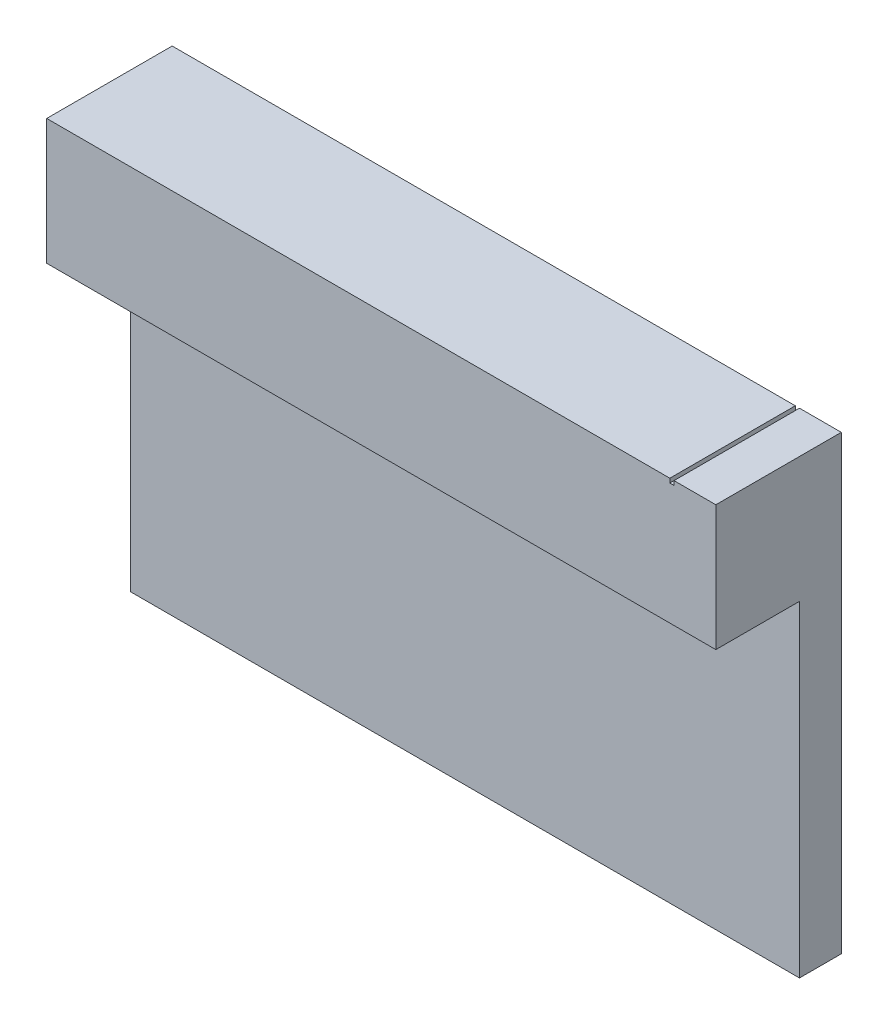
ISO-10303-21;
HEADER;
FILE_DESCRIPTION(('STEP AP214'),'2;1');
FILE_NAME('part.step','',(''),(''),'','','');
FILE_SCHEMA(('AUTOMOTIVE_DESIGN { 1 0 10303 214 1 1 1 1 }'));
ENDSEC;
DATA;
#1=APPLICATION_CONTEXT('core data for automotive mechanical design processes');
#2=APPLICATION_PROTOCOL_DEFINITION('international standard','automotive_design',2000,#1);
#3=PRODUCT_CONTEXT('',#1,'mechanical');
#4=PRODUCT('Part','Part','',(#3));
#5=PRODUCT_RELATED_PRODUCT_CATEGORY('part','',(#4));
#6=PRODUCT_DEFINITION_FORMATION('','',#4);
#7=PRODUCT_DEFINITION_CONTEXT('part definition',#1,'design');
#8=PRODUCT_DEFINITION('design','',#6,#7);
#9=PRODUCT_DEFINITION_SHAPE('','',#8);
#10=(LENGTH_UNIT() NAMED_UNIT(*) SI_UNIT(.MILLI.,.METRE.));
#11=(NAMED_UNIT(*) PLANE_ANGLE_UNIT() SI_UNIT($,.RADIAN.));
#12=(NAMED_UNIT(*) SI_UNIT($,.STERADIAN.) SOLID_ANGLE_UNIT());
#13=UNCERTAINTY_MEASURE_WITH_UNIT(LENGTH_MEASURE(1.E-05),#10,'distance_accuracy_value','');
#14=(GEOMETRIC_REPRESENTATION_CONTEXT(3) GLOBAL_UNCERTAINTY_ASSIGNED_CONTEXT((#13)) GLOBAL_UNIT_ASSIGNED_CONTEXT((#10,
#11,#12)) REPRESENTATION_CONTEXT('',''));
#15=CARTESIAN_POINT('',(0.,0.,0.));
#16=DIRECTION('',(0.,0.,1.));
#17=DIRECTION('',(1.,0.,0.));
#18=AXIS2_PLACEMENT_3D('',#15,#16,#17);
#19=CARTESIAN_POINT('',(-52.8123523343083,21.9483402489627,10.));
#20=DIRECTION('',(0.,-1.,0.));
#21=DIRECTION('',(0.,0.,-1.));
#22=AXIS2_PLACEMENT_3D('',#19,#20,#21);
#23=PLANE('',#22);
#24=DIRECTION('',(-1.,0.,0.));
#25=VECTOR('',#24,1.);
#26=CARTESIAN_POINT('',(-52.8123523343083,21.9483402489627,30.));
#27=LINE('',#26,#25);
#28=CARTESIAN_POINT('',(96.1876476656917,21.9483402489627,30.));
#29=VERTEX_POINT('',#28);
#30=CARTESIAN_POINT('',(-52.8123523343083,21.9483402489627,30.));
#31=VERTEX_POINT('',#30);
#32=EDGE_CURVE('E147',#29,#31,#27,.T.);
#33=ORIENTED_EDGE('',*,*,#32,.F.);
#34=DIRECTION('',(0.,0.,1.));
#35=VECTOR('',#34,1.);
#36=CARTESIAN_POINT('',(96.1876476656917,21.9483402489627,0.));
#37=LINE('',#36,#35);
#38=CARTESIAN_POINT('',(96.1876476656917,21.9483402489627,0.));
#39=VERTEX_POINT('',#38);
#40=EDGE_CURVE('E205',#39,#29,#37,.T.);
#41=ORIENTED_EDGE('',*,*,#40,.F.);
#42=DIRECTION('',(-1.,0.,0.));
#43=VECTOR('',#42,1.);
#44=CARTESIAN_POINT('',(-52.8123523343083,21.9483402489627,0.));
#45=LINE('',#44,#43);
#46=CARTESIAN_POINT('',(-52.8123523343083,21.9483402489627,0.));
#47=VERTEX_POINT('',#46);
#48=EDGE_CURVE('E180',#39,#47,#45,.T.);
#49=ORIENTED_EDGE('',*,*,#48,.T.);
#50=DIRECTION('',(0.,0.,-1.));
#51=VECTOR('',#50,1.);
#52=CARTESIAN_POINT('',(-52.8123523343083,21.9483402489627,10.));
#53=LINE('',#52,#51);
#54=EDGE_CURVE('E185',#31,#47,#53,.T.);
#55=ORIENTED_EDGE('',*,*,#54,.F.);
#56=EDGE_LOOP('',(#33,#41,#49,#55));
#57=FACE_BOUND('',#56,.T.);
#58=ADVANCED_FACE('F33',(#57),#23,.F.);
#59=CARTESIAN_POINT('',(-52.8123523343083,21.9483402489627,10.));
#60=DIRECTION('',(1.,0.,0.));
#61=DIRECTION('',(0.,1.,0.));
#62=AXIS2_PLACEMENT_3D('',#59,#60,#61);
#63=PLANE('',#62);
#64=DIRECTION('',(0.,-1.,0.));
#65=VECTOR('',#64,1.);
#66=CARTESIAN_POINT('',(-52.8123523343083,21.9483402489627,0.));
#67=LINE('',#66,#65);
#68=CARTESIAN_POINT('',(-52.8123523343083,-86.0516597510373,0.));
#69=VERTEX_POINT('',#68);
#70=EDGE_CURVE('E165',#47,#69,#67,.T.);
#71=ORIENTED_EDGE('',*,*,#70,.T.);
#72=DIRECTION('',(0.,0.,-1.));
#73=VECTOR('',#72,1.);
#74=CARTESIAN_POINT('',(-52.8123523343083,-86.0516597510373,10.));
#75=LINE('',#74,#73);
#76=CARTESIAN_POINT('',(-52.8123523343083,-86.0516597510373,10.));
#77=VERTEX_POINT('',#76);
#78=EDGE_CURVE('E11',#77,#69,#75,.T.);
#79=ORIENTED_EDGE('',*,*,#78,.F.);
#80=DIRECTION('',(0.,-1.,0.));
#81=VECTOR('',#80,1.);
#82=CARTESIAN_POINT('',(-52.8123523343083,21.9483402489627,10.));
#83=LINE('',#82,#81);
#84=CARTESIAN_POINT('',(-52.8123523343083,-8.05165975103735,10.));
#85=VERTEX_POINT('',#84);
#86=EDGE_CURVE('E184',#85,#77,#83,.T.);
#87=ORIENTED_EDGE('',*,*,#86,.F.);
#88=DIRECTION('',(0.,0.,-1.));
#89=VECTOR('',#88,1.);
#90=CARTESIAN_POINT('',(-52.8123523343083,-8.05165975103735,30.));
#91=LINE('',#90,#89);
#92=CARTESIAN_POINT('',(-52.8123523343083,-8.05165975103735,30.));
#93=VERTEX_POINT('',#92);
#94=EDGE_CURVE('E162',#93,#85,#91,.T.);
#95=ORIENTED_EDGE('',*,*,#94,.F.);
#96=DIRECTION('',(0.,-1.,0.));
#97=VECTOR('',#96,1.);
#98=CARTESIAN_POINT('',(-52.8123523343083,21.9483402489627,30.));
#99=LINE('',#98,#97);
#100=EDGE_CURVE('E140',#31,#93,#99,.T.);
#101=ORIENTED_EDGE('',*,*,#100,.F.);
#102=ORIENTED_EDGE('',*,*,#54,.T.);
#103=EDGE_LOOP('',(#71,#79,#87,#95,#101,#102));
#104=FACE_BOUND('',#103,.T.);
#105=ADVANCED_FACE('F35',(#104),#63,.F.);
#106=CARTESIAN_POINT('',(-52.8123523343083,-86.0516597510373,10.));
#107=DIRECTION('',(0.,1.,0.));
#108=DIRECTION('',(0.,0.,1.));
#109=AXIS2_PLACEMENT_3D('',#106,#107,#108);
#110=PLANE('',#109);
#111=DIRECTION('',(1.,0.,0.));
#112=VECTOR('',#111,1.);
#113=CARTESIAN_POINT('',(-52.8123523343083,-86.0516597510373,0.));
#114=LINE('',#113,#112);
#115=CARTESIAN_POINT('',(107.187647665692,-86.0516597510373,0.));
#116=VERTEX_POINT('',#115);
#117=EDGE_CURVE('E169',#69,#116,#114,.T.);
#118=ORIENTED_EDGE('',*,*,#117,.T.);
#119=DIRECTION('',(0.,0.,-1.));
#120=VECTOR('',#119,1.);
#121=CARTESIAN_POINT('',(107.187647665692,-86.0516597510373,10.));
#122=LINE('',#121,#120);
#123=CARTESIAN_POINT('',(107.187647665692,-86.0516597510373,10.));
#124=VERTEX_POINT('',#123);
#125=EDGE_CURVE('E42',#124,#116,#122,.T.);
#126=ORIENTED_EDGE('',*,*,#125,.F.);
#127=DIRECTION('',(1.,0.,0.));
#128=VECTOR('',#127,1.);
#129=CARTESIAN_POINT('',(-52.8123523343083,-86.0516597510373,10.));
#130=LINE('',#129,#128);
#131=EDGE_CURVE('E191',#77,#124,#130,.T.);
#132=ORIENTED_EDGE('',*,*,#131,.F.);
#133=ORIENTED_EDGE('',*,*,#78,.T.);
#134=EDGE_LOOP('',(#118,#126,#132,#133));
#135=FACE_BOUND('',#134,.T.);
#136=ADVANCED_FACE('F222',(#135),#110,.F.);
#137=CARTESIAN_POINT('',(107.187647665692,21.9483402489627,10.));
#138=DIRECTION('',(-1.,0.,0.));
#139=DIRECTION('',(0.,0.,1.));
#140=AXIS2_PLACEMENT_3D('',#137,#138,#139);
#141=PLANE('',#140);
#142=DIRECTION('',(0.,1.,0.));
#143=VECTOR('',#142,1.);
#144=CARTESIAN_POINT('',(107.187647665692,21.9483402489627,0.));
#145=LINE('',#144,#143);
#146=CARTESIAN_POINT('',(107.187647665692,21.9483402489627,0.));
#147=VERTEX_POINT('',#146);
#148=EDGE_CURVE('E175',#116,#147,#145,.T.);
#149=ORIENTED_EDGE('',*,*,#148,.T.);
#150=DIRECTION('',(0.,0.,-1.));
#151=VECTOR('',#150,1.);
#152=CARTESIAN_POINT('',(107.187647665692,21.9483402489627,10.));
#153=LINE('',#152,#151);
#154=CARTESIAN_POINT('',(107.187647665692,21.9483402489627,30.));
#155=VERTEX_POINT('',#154);
#156=EDGE_CURVE('E187',#155,#147,#153,.T.);
#157=ORIENTED_EDGE('',*,*,#156,.F.);
#158=DIRECTION('',(0.,1.,0.));
#159=VECTOR('',#158,1.);
#160=CARTESIAN_POINT('',(107.187647665692,21.9483402489627,30.));
#161=LINE('',#160,#159);
#162=CARTESIAN_POINT('',(107.187647665692,-8.05165975103735,30.));
#163=VERTEX_POINT('',#162);
#164=EDGE_CURVE('E145',#163,#155,#161,.T.);
#165=ORIENTED_EDGE('',*,*,#164,.F.);
#166=DIRECTION('',(0.,0.,-1.));
#167=VECTOR('',#166,1.);
#168=CARTESIAN_POINT('',(107.187647665692,-8.05165975103735,30.));
#169=LINE('',#168,#167);
#170=CARTESIAN_POINT('',(107.187647665692,-8.05165975103735,10.));
#171=VERTEX_POINT('',#170);
#172=EDGE_CURVE('E149',#163,#171,#169,.T.);
#173=ORIENTED_EDGE('',*,*,#172,.T.);
#174=DIRECTION('',(0.,1.,0.));
#175=VECTOR('',#174,1.);
#176=CARTESIAN_POINT('',(107.187647665692,21.9483402489627,10.));
#177=LINE('',#176,#175);
#178=EDGE_CURVE('E157',#124,#171,#177,.T.);
#179=ORIENTED_EDGE('',*,*,#178,.F.);
#180=ORIENTED_EDGE('',*,*,#125,.T.);
#181=EDGE_LOOP('',(#149,#157,#165,#173,#179,#180));
#182=FACE_BOUND('',#181,.T.);
#183=ADVANCED_FACE('F200',(#182),#141,.F.);
#184=CARTESIAN_POINT('',(97.1876476656917,21.9483402489627,0.));
#185=VERTEX_POINT('',#184);
#186=EDGE_CURVE('E181',#147,#185,#45,.T.);
#187=ORIENTED_EDGE('',*,*,#186,.T.);
#188=DIRECTION('',(0.,0.,-1.));
#189=VECTOR('',#188,1.);
#190=CARTESIAN_POINT('',(97.1876476656917,21.9483402489627,0.));
#191=LINE('',#190,#189);
#192=CARTESIAN_POINT('',(97.1876476656917,21.9483402489627,30.));
#193=VERTEX_POINT('',#192);
#194=EDGE_CURVE('E204',#193,#185,#191,.T.);
#195=ORIENTED_EDGE('',*,*,#194,.F.);
#196=EDGE_CURVE('E132',#155,#193,#27,.T.);
#197=ORIENTED_EDGE('',*,*,#196,.F.);
#198=ORIENTED_EDGE('',*,*,#156,.T.);
#199=EDGE_LOOP('',(#187,#195,#197,#198));
#200=FACE_BOUND('',#199,.T.);
#201=ADVANCED_FACE('F202',(#200),#23,.F.);
#202=CARTESIAN_POINT('',(0.,0.,10.));
#203=DIRECTION('',(0.,0.,1.));
#204=DIRECTION('',(1.,0.,0.));
#205=AXIS2_PLACEMENT_3D('',#202,#203,#204);
#206=PLANE('',#205);
#207=DIRECTION('',(1.,0.,0.));
#208=VECTOR('',#207,1.);
#209=CARTESIAN_POINT('',(-52.8123523343083,-8.05165975103735,10.));
#210=LINE('',#209,#208);
#211=EDGE_CURVE('E58',#85,#171,#210,.T.);
#212=ORIENTED_EDGE('',*,*,#211,.F.);
#213=ORIENTED_EDGE('',*,*,#86,.T.);
#214=ORIENTED_EDGE('',*,*,#131,.T.);
#215=ORIENTED_EDGE('',*,*,#178,.T.);
#216=EDGE_LOOP('',(#212,#213,#214,#215));
#217=FACE_BOUND('',#216,.T.);
#218=ADVANCED_FACE('F195',(#217),#206,.T.);
#219=CARTESIAN_POINT('',(0.,0.,0.));
#220=DIRECTION('',(0.,0.,1.));
#221=DIRECTION('',(1.,0.,0.));
#222=AXIS2_PLACEMENT_3D('',#219,#220,#221);
#223=PLANE('',#222);
#224=ORIENTED_EDGE('',*,*,#48,.F.);
#225=DIRECTION('',(0.,1.,0.));
#226=VECTOR('',#225,1.);
#227=CARTESIAN_POINT('',(96.1876476656917,20.9483402489627,0.));
#228=LINE('',#227,#226);
#229=CARTESIAN_POINT('',(96.1876476656917,20.9483402489627,0.));
#230=VERTEX_POINT('',#229);
#231=EDGE_CURVE('E135',#230,#39,#228,.T.);
#232=ORIENTED_EDGE('',*,*,#231,.F.);
#233=DIRECTION('',(-1.,0.,0.));
#234=VECTOR('',#233,1.);
#235=CARTESIAN_POINT('',(96.1876476656917,20.9483402489627,0.));
#236=LINE('',#235,#234);
#237=CARTESIAN_POINT('',(97.1876476656917,20.9483402489627,0.));
#238=VERTEX_POINT('',#237);
#239=EDGE_CURVE('E120',#238,#230,#236,.T.);
#240=ORIENTED_EDGE('',*,*,#239,.F.);
#241=DIRECTION('',(0.,1.,0.));
#242=VECTOR('',#241,1.);
#243=CARTESIAN_POINT('',(97.1876476656917,20.9483402489627,0.));
#244=LINE('',#243,#242);
#245=EDGE_CURVE('E118',#238,#185,#244,.T.);
#246=ORIENTED_EDGE('',*,*,#245,.T.);
#247=ORIENTED_EDGE('',*,*,#186,.F.);
#248=ORIENTED_EDGE('',*,*,#148,.F.);
#249=ORIENTED_EDGE('',*,*,#117,.F.);
#250=ORIENTED_EDGE('',*,*,#70,.F.);
#251=EDGE_LOOP('',(#224,#232,#240,#246,#247,#248,#249,#250));
#252=FACE_BOUND('',#251,.T.);
#253=ADVANCED_FACE('F219',(#252),#223,.F.);
#254=CARTESIAN_POINT('',(-52.8123523343083,-8.05165975103735,30.));
#255=DIRECTION('',(0.,1.,0.));
#256=DIRECTION('',(0.,0.,1.));
#257=AXIS2_PLACEMENT_3D('',#254,#255,#256);
#258=PLANE('',#257);
#259=ORIENTED_EDGE('',*,*,#211,.T.);
#260=ORIENTED_EDGE('',*,*,#172,.F.);
#261=DIRECTION('',(1.,0.,0.));
#262=VECTOR('',#261,1.);
#263=CARTESIAN_POINT('',(-52.8123523343083,-8.05165975103735,30.));
#264=LINE('',#263,#262);
#265=EDGE_CURVE('E143',#93,#163,#264,.T.);
#266=ORIENTED_EDGE('',*,*,#265,.F.);
#267=ORIENTED_EDGE('',*,*,#94,.T.);
#268=EDGE_LOOP('',(#259,#260,#266,#267));
#269=FACE_BOUND('',#268,.T.);
#270=ADVANCED_FACE('F198',(#269),#258,.F.);
#271=CARTESIAN_POINT('',(0.,0.,30.));
#272=DIRECTION('',(0.,0.,1.));
#273=DIRECTION('',(1.,0.,0.));
#274=AXIS2_PLACEMENT_3D('',#271,#272,#273);
#275=PLANE('',#274);
#276=DIRECTION('',(0.,1.,0.));
#277=VECTOR('',#276,1.);
#278=CARTESIAN_POINT('',(96.1876476656917,20.9483402489627,30.));
#279=LINE('',#278,#277);
#280=CARTESIAN_POINT('',(96.1876476656917,20.9483402489627,30.));
#281=VERTEX_POINT('',#280);
#282=EDGE_CURVE('E133',#281,#29,#279,.T.);
#283=ORIENTED_EDGE('',*,*,#282,.T.);
#284=ORIENTED_EDGE('',*,*,#32,.T.);
#285=ORIENTED_EDGE('',*,*,#100,.T.);
#286=ORIENTED_EDGE('',*,*,#265,.T.);
#287=ORIENTED_EDGE('',*,*,#164,.T.);
#288=ORIENTED_EDGE('',*,*,#196,.T.);
#289=DIRECTION('',(0.,1.,0.));
#290=VECTOR('',#289,1.);
#291=CARTESIAN_POINT('',(97.1876476656917,20.9483402489627,30.));
#292=LINE('',#291,#290);
#293=CARTESIAN_POINT('',(97.1876476656917,20.9483402489627,30.));
#294=VERTEX_POINT('',#293);
#295=EDGE_CURVE('E115',#294,#193,#292,.T.);
#296=ORIENTED_EDGE('',*,*,#295,.F.);
#297=DIRECTION('',(1.,0.,0.));
#298=VECTOR('',#297,1.);
#299=CARTESIAN_POINT('',(96.1876476656917,20.9483402489627,30.));
#300=LINE('',#299,#298);
#301=EDGE_CURVE('E121',#281,#294,#300,.T.);
#302=ORIENTED_EDGE('',*,*,#301,.F.);
#303=EDGE_LOOP('',(#283,#284,#285,#286,#287,#288,#296,#302));
#304=FACE_BOUND('',#303,.T.);
#305=ADVANCED_FACE('F129',(#304),#275,.T.);
#306=CARTESIAN_POINT('',(96.1876476656917,20.9483402489627,0.));
#307=DIRECTION('',(-1.,0.,0.));
#308=DIRECTION('',(0.,0.,1.));
#309=AXIS2_PLACEMENT_3D('',#306,#307,#308);
#310=PLANE('',#309);
#311=ORIENTED_EDGE('',*,*,#40,.T.);
#312=ORIENTED_EDGE('',*,*,#282,.F.);
#313=DIRECTION('',(0.,0.,1.));
#314=VECTOR('',#313,1.);
#315=CARTESIAN_POINT('',(96.1876476656917,20.9483402489627,0.));
#316=LINE('',#315,#314);
#317=EDGE_CURVE('E50',#230,#281,#316,.T.);
#318=ORIENTED_EDGE('',*,*,#317,.F.);
#319=ORIENTED_EDGE('',*,*,#231,.T.);
#320=EDGE_LOOP('',(#311,#312,#318,#319));
#321=FACE_BOUND('',#320,.T.);
#322=ADVANCED_FACE('F213',(#321),#310,.F.);
#323=CARTESIAN_POINT('',(97.1876476656917,20.9483402489627,0.));
#324=DIRECTION('',(1.,0.,0.));
#325=DIRECTION('',(0.,0.,-1.));
#326=AXIS2_PLACEMENT_3D('',#323,#324,#325);
#327=PLANE('',#326);
#328=ORIENTED_EDGE('',*,*,#194,.T.);
#329=ORIENTED_EDGE('',*,*,#245,.F.);
#330=DIRECTION('',(0.,0.,-1.));
#331=VECTOR('',#330,1.);
#332=CARTESIAN_POINT('',(97.1876476656917,20.9483402489627,0.));
#333=LINE('',#332,#331);
#334=EDGE_CURVE('E112',#294,#238,#333,.T.);
#335=ORIENTED_EDGE('',*,*,#334,.F.);
#336=ORIENTED_EDGE('',*,*,#295,.T.);
#337=EDGE_LOOP('',(#328,#329,#335,#336));
#338=FACE_BOUND('',#337,.T.);
#339=ADVANCED_FACE('F113',(#338),#327,.F.);
#340=CARTESIAN_POINT('',(0.,20.9483402489627,0.));
#341=DIRECTION('',(0.,1.,0.));
#342=DIRECTION('',(0.,0.,1.));
#343=AXIS2_PLACEMENT_3D('',#340,#341,#342);
#344=PLANE('',#343);
#345=ORIENTED_EDGE('',*,*,#317,.T.);
#346=ORIENTED_EDGE('',*,*,#301,.T.);
#347=ORIENTED_EDGE('',*,*,#334,.T.);
#348=ORIENTED_EDGE('',*,*,#239,.T.);
#349=EDGE_LOOP('',(#345,#346,#347,#348));
#350=FACE_BOUND('',#349,.T.);
#351=ADVANCED_FACE('F124',(#350),#344,.T.);
#352=CLOSED_SHELL('',(#58,#105,#136,#183,#201,#218,#253,#270,#305,#322,#339,#351));
#353=MANIFOLD_SOLID_BREP('B2',#352);
#354=ADVANCED_BREP_SHAPE_REPRESENTATION('',(#18,#353),#14);
#355=SHAPE_DEFINITION_REPRESENTATION(#9,#354);
ENDSEC;
END-ISO-10303-21;
